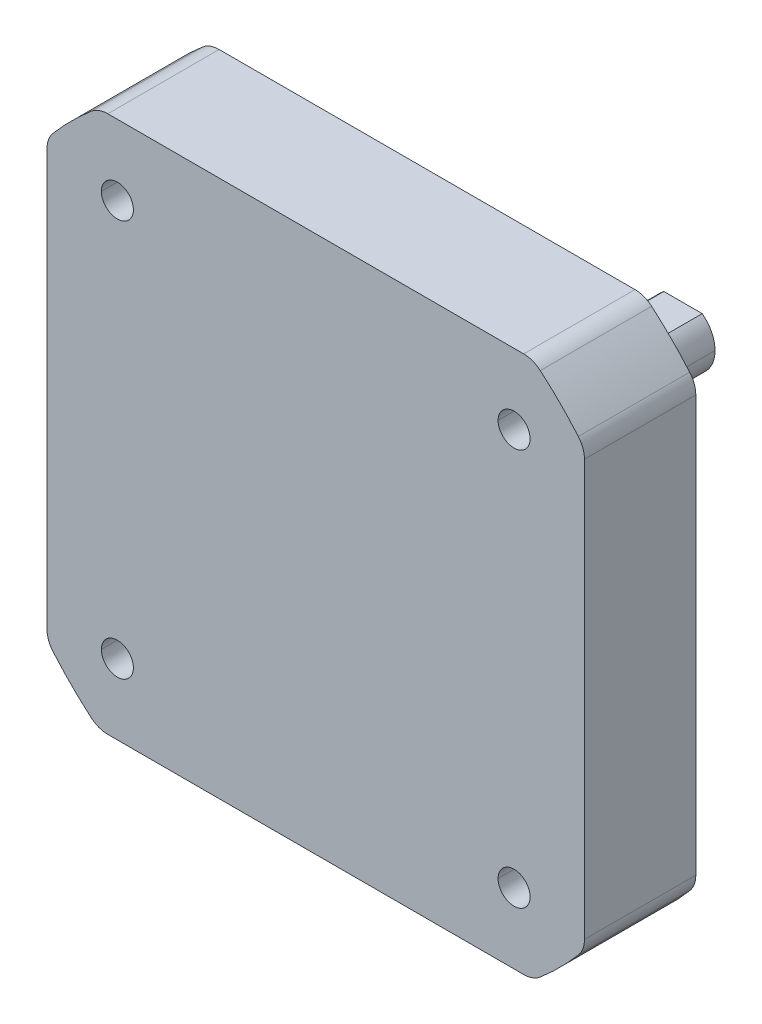
ISO-10303-21;
HEADER;
FILE_DESCRIPTION(('STEP AP214'),'2;1');
FILE_NAME('part.step','',(''),(''),'','','');
FILE_SCHEMA(('AUTOMOTIVE_DESIGN { 1 0 10303 214 1 1 1 1 }'));
ENDSEC;
DATA;
#1=APPLICATION_CONTEXT('core data for automotive mechanical design processes');
#2=APPLICATION_PROTOCOL_DEFINITION('international standard','automotive_design',2000,#1);
#3=PRODUCT_CONTEXT('',#1,'mechanical');
#4=PRODUCT('Part','Part','',(#3));
#5=PRODUCT_RELATED_PRODUCT_CATEGORY('part','',(#4));
#6=PRODUCT_DEFINITION_FORMATION('','',#4);
#7=PRODUCT_DEFINITION_CONTEXT('part definition',#1,'design');
#8=PRODUCT_DEFINITION('design','',#6,#7);
#9=PRODUCT_DEFINITION_SHAPE('','',#8);
#10=(LENGTH_UNIT() NAMED_UNIT(*) SI_UNIT(.MILLI.,.METRE.));
#11=(NAMED_UNIT(*) PLANE_ANGLE_UNIT() SI_UNIT($,.RADIAN.));
#12=(NAMED_UNIT(*) SI_UNIT($,.STERADIAN.) SOLID_ANGLE_UNIT());
#13=UNCERTAINTY_MEASURE_WITH_UNIT(LENGTH_MEASURE(1.E-05),#10,'distance_accuracy_value','');
#14=(GEOMETRIC_REPRESENTATION_CONTEXT(3) GLOBAL_UNCERTAINTY_ASSIGNED_CONTEXT((#13)) GLOBAL_UNIT_ASSIGNED_CONTEXT((#10,
#11,#12)) REPRESENTATION_CONTEXT('',''));
#15=CARTESIAN_POINT('',(0.,0.,0.));
#16=DIRECTION('',(0.,0.,1.));
#17=DIRECTION('',(1.,0.,0.));
#18=AXIS2_PLACEMENT_3D('',#15,#16,#17);
#19=CARTESIAN_POINT('',(0.,0.,-5.));
#20=DIRECTION('',(0.,0.,-1.));
#21=DIRECTION('',(0.,-1.,0.));
#22=AXIS2_PLACEMENT_3D('',#19,#20,#21);
#23=PLANE('',#22);
#24=CARTESIAN_POINT('',(0.,0.,-5.));
#25=DIRECTION('',(0.,0.,-1.));
#26=DIRECTION('',(-1.,0.,0.));
#27=AXIS2_PLACEMENT_3D('',#24,#25,#26);
#28=CIRCLE('',#27,2.5);
#29=CARTESIAN_POINT('',(-1.5,2.,-5.));
#30=VERTEX_POINT('',#29);
#31=CARTESIAN_POINT('',(1.5,2.,-5.));
#32=VERTEX_POINT('',#31);
#33=EDGE_CURVE('E318',#30,#32,#28,.T.);
#34=ORIENTED_EDGE('',*,*,#33,.T.);
#35=DIRECTION('',(-1.,0.,0.));
#36=VECTOR('',#35,1.);
#37=CARTESIAN_POINT('',(1.5,2.,-5.));
#38=LINE('',#37,#36);
#39=EDGE_CURVE('E11',#32,#30,#38,.T.);
#40=ORIENTED_EDGE('',*,*,#39,.T.);
#41=EDGE_LOOP('',(#34,#40));
#42=FACE_BOUND('',#41,.T.);
#43=ADVANCED_FACE('F17',(#42),#23,.T.);
#44=CARTESIAN_POINT('',(1.5,2.,-5.));
#45=DIRECTION('',(0.,-1.,0.));
#46=DIRECTION('',(0.,0.,-1.));
#47=AXIS2_PLACEMENT_3D('',#44,#45,#46);
#48=PLANE('',#47);
#49=DIRECTION('',(-1.,0.,0.));
#50=VECTOR('',#49,1.);
#51=CARTESIAN_POINT('',(1.5,2.,-20.));
#52=LINE('',#51,#50);
#53=CARTESIAN_POINT('',(1.5,2.,-20.));
#54=VERTEX_POINT('',#53);
#55=CARTESIAN_POINT('',(-1.5,2.,-20.));
#56=VERTEX_POINT('',#55);
#57=EDGE_CURVE('E26',#54,#56,#52,.T.);
#58=ORIENTED_EDGE('',*,*,#57,.T.);
#59=DIRECTION('',(0.,0.,-1.));
#60=VECTOR('',#59,1.);
#61=CARTESIAN_POINT('',(-1.5,2.,-5.));
#62=LINE('',#61,#60);
#63=EDGE_CURVE('E307',#30,#56,#62,.T.);
#64=ORIENTED_EDGE('',*,*,#63,.F.);
#65=ORIENTED_EDGE('',*,*,#39,.F.);
#66=DIRECTION('',(0.,0.,-1.));
#67=VECTOR('',#66,1.);
#68=CARTESIAN_POINT('',(1.5,2.,-5.));
#69=LINE('',#68,#67);
#70=EDGE_CURVE('E315',#32,#54,#69,.T.);
#71=ORIENTED_EDGE('',*,*,#70,.T.);
#72=EDGE_LOOP('',(#58,#64,#65,#71));
#73=FACE_BOUND('',#72,.T.);
#74=ADVANCED_FACE('F685',(#73),#48,.F.);
#75=CARTESIAN_POINT('',(0.,0.,-20.));
#76=DIRECTION('',(0.,0.,-1.));
#77=DIRECTION('',(0.,-1.,0.));
#78=AXIS2_PLACEMENT_3D('',#75,#76,#77);
#79=PLANE('',#78);
#80=ORIENTED_EDGE('',*,*,#57,.F.);
#81=CARTESIAN_POINT('',(0.,0.,-20.));
#82=DIRECTION('',(0.,0.,-1.));
#83=DIRECTION('',(-1.,0.,0.));
#84=AXIS2_PLACEMENT_3D('',#81,#82,#83);
#85=CIRCLE('',#84,2.5);
#86=CARTESIAN_POINT('',(2.5,0.,-20.));
#87=VERTEX_POINT('',#86);
#88=EDGE_CURVE('E286',#54,#87,#85,.T.);
#89=ORIENTED_EDGE('',*,*,#88,.T.);
#90=CARTESIAN_POINT('',(0.,0.,-20.));
#91=DIRECTION('',(0.,0.,-1.));
#92=DIRECTION('',(-1.,0.,0.));
#93=AXIS2_PLACEMENT_3D('',#90,#91,#92);
#94=CIRCLE('',#93,2.5);
#95=CARTESIAN_POINT('',(-2.5,0.,-20.));
#96=VERTEX_POINT('',#95);
#97=EDGE_CURVE('E280',#87,#96,#94,.T.);
#98=ORIENTED_EDGE('',*,*,#97,.T.);
#99=CARTESIAN_POINT('',(0.,0.,-20.));
#100=DIRECTION('',(0.,0.,-1.));
#101=DIRECTION('',(-1.,0.,0.));
#102=AXIS2_PLACEMENT_3D('',#99,#100,#101);
#103=CIRCLE('',#102,2.5);
#104=EDGE_CURVE('E284',#96,#56,#103,.T.);
#105=ORIENTED_EDGE('',*,*,#104,.T.);
#106=EDGE_LOOP('',(#80,#89,#98,#105));
#107=FACE_BOUND('',#106,.T.);
#108=ADVANCED_FACE('F282',(#107),#79,.T.);
#109=CARTESIAN_POINT('',(0.,0.,-20.));
#110=DIRECTION('',(0.,0.,1.));
#111=DIRECTION('',(1.,0.,0.));
#112=AXIS2_PLACEMENT_3D('',#109,#110,#111);
#113=CYLINDRICAL_SURFACE('',#112,2.5);
#114=DIRECTION('',(0.,0.,1.));
#115=VECTOR('',#114,1.);
#116=CARTESIAN_POINT('',(-2.5,0.,-20.));
#117=LINE('',#116,#115);
#118=CARTESIAN_POINT('',(-2.5,0.,-1.5));
#119=VERTEX_POINT('',#118);
#120=EDGE_CURVE('E294',#96,#119,#117,.T.);
#121=ORIENTED_EDGE('',*,*,#120,.F.);
#122=ORIENTED_EDGE('',*,*,#97,.F.);
#123=DIRECTION('',(0.,0.,1.));
#124=VECTOR('',#123,1.);
#125=CARTESIAN_POINT('',(2.5,0.,-20.));
#126=LINE('',#125,#124);
#127=CARTESIAN_POINT('',(2.5,0.,-1.5));
#128=VERTEX_POINT('',#127);
#129=EDGE_CURVE('E340',#87,#128,#126,.T.);
#130=ORIENTED_EDGE('',*,*,#129,.T.);
#131=CARTESIAN_POINT('',(0.,0.,-1.5));
#132=DIRECTION('',(0.,0.,1.));
#133=DIRECTION('',(-1.,0.,0.));
#134=AXIS2_PLACEMENT_3D('',#131,#132,#133);
#135=CIRCLE('',#134,2.5);
#136=EDGE_CURVE('E296',#119,#128,#135,.T.);
#137=ORIENTED_EDGE('',*,*,#136,.F.);
#138=EDGE_LOOP('',(#121,#122,#130,#137));
#139=FACE_BOUND('',#138,.T.);
#140=ADVANCED_FACE('F295',(#139),#113,.T.);
#141=CARTESIAN_POINT('',(0.,0.,-1.5));
#142=DIRECTION('',(0.,0.,1.));
#143=DIRECTION('',(1.,0.,0.));
#144=AXIS2_PLACEMENT_3D('',#141,#142,#143);
#145=CYLINDRICAL_SURFACE('',#144,11.);
#146=DIRECTION('',(0.,0.,1.));
#147=VECTOR('',#146,1.);
#148=CARTESIAN_POINT('',(-11.,0.,-1.5));
#149=LINE('',#148,#147);
#150=CARTESIAN_POINT('',(-11.,0.,-1.5));
#151=VERTEX_POINT('',#150);
#152=CARTESIAN_POINT('',(-11.,0.,0.));
#153=VERTEX_POINT('',#152);
#154=EDGE_CURVE('E365',#151,#153,#149,.T.);
#155=ORIENTED_EDGE('',*,*,#154,.F.);
#156=CARTESIAN_POINT('',(0.,0.,-1.5));
#157=DIRECTION('',(0.,0.,-1.));
#158=DIRECTION('',(-1.,0.,0.));
#159=AXIS2_PLACEMENT_3D('',#156,#157,#158);
#160=CIRCLE('',#159,11.);
#161=CARTESIAN_POINT('',(11.,0.,-1.5));
#162=VERTEX_POINT('',#161);
#163=EDGE_CURVE('E453',#162,#151,#160,.T.);
#164=ORIENTED_EDGE('',*,*,#163,.F.);
#165=DIRECTION('',(0.,0.,1.));
#166=VECTOR('',#165,1.);
#167=CARTESIAN_POINT('',(11.,0.,-1.5));
#168=LINE('',#167,#166);
#169=CARTESIAN_POINT('',(11.,0.,0.));
#170=VERTEX_POINT('',#169);
#171=EDGE_CURVE('E373',#162,#170,#168,.T.);
#172=ORIENTED_EDGE('',*,*,#171,.T.);
#173=CARTESIAN_POINT('',(0.,0.,0.));
#174=DIRECTION('',(0.,0.,-1.));
#175=DIRECTION('',(-1.,0.,0.));
#176=AXIS2_PLACEMENT_3D('',#173,#174,#175);
#177=CIRCLE('',#176,11.);
#178=EDGE_CURVE('E405',#170,#153,#177,.T.);
#179=ORIENTED_EDGE('',*,*,#178,.T.);
#180=EDGE_LOOP('',(#155,#164,#172,#179));
#181=FACE_BOUND('',#180,.T.);
#182=ADVANCED_FACE('F706',(#181),#145,.T.);
#183=CARTESIAN_POINT('',(15.5,15.5,0.));
#184=DIRECTION('',(0.,0.,-1.));
#185=DIRECTION('',(-1.,0.,0.));
#186=AXIS2_PLACEMENT_3D('',#183,#184,#185);
#187=CYLINDRICAL_SURFACE('',#186,1.24999999999999);
#188=DIRECTION('',(0.,0.,-1.));
#189=VECTOR('',#188,1.);
#190=CARTESIAN_POINT('',(16.75,15.5,0.));
#191=LINE('',#190,#189);
#192=CARTESIAN_POINT('',(16.75,15.5,8.7));
#193=VERTEX_POINT('',#192);
#194=CARTESIAN_POINT('',(16.75,15.5,0.));
#195=VERTEX_POINT('',#194);
#196=EDGE_CURVE('E324',#193,#195,#191,.T.);
#197=ORIENTED_EDGE('',*,*,#196,.F.);
#198=CARTESIAN_POINT('',(15.5,15.5,8.7));
#199=DIRECTION('',(0.,0.,-1.));
#200=DIRECTION('',(-1.,0.,0.));
#201=AXIS2_PLACEMENT_3D('',#198,#199,#200);
#202=CIRCLE('',#201,1.24999999999999);
#203=CARTESIAN_POINT('',(14.25,15.5,8.7));
#204=VERTEX_POINT('',#203);
#205=EDGE_CURVE('E439',#204,#193,#202,.T.);
#206=ORIENTED_EDGE('',*,*,#205,.F.);
#207=DIRECTION('',(0.,0.,-1.));
#208=VECTOR('',#207,1.);
#209=CARTESIAN_POINT('',(14.25,15.5,0.));
#210=LINE('',#209,#208);
#211=CARTESIAN_POINT('',(14.25,15.5,0.));
#212=VERTEX_POINT('',#211);
#213=EDGE_CURVE('E344',#204,#212,#210,.T.);
#214=ORIENTED_EDGE('',*,*,#213,.T.);
#215=CARTESIAN_POINT('',(15.5,15.5,0.));
#216=DIRECTION('',(0.,0.,-1.));
#217=DIRECTION('',(-1.,0.,0.));
#218=AXIS2_PLACEMENT_3D('',#215,#216,#217);
#219=CIRCLE('',#218,1.24999999999999);
#220=EDGE_CURVE('E409',#212,#195,#219,.T.);
#221=ORIENTED_EDGE('',*,*,#220,.T.);
#222=EDGE_LOOP('',(#197,#206,#214,#221));
#223=FACE_BOUND('',#222,.T.);
#224=ADVANCED_FACE('F739',(#223),#187,.F.);
#225=CARTESIAN_POINT('',(-15.5,15.5,0.));
#226=DIRECTION('',(0.,0.,-1.));
#227=DIRECTION('',(-1.,0.,0.));
#228=AXIS2_PLACEMENT_3D('',#225,#226,#227);
#229=CYLINDRICAL_SURFACE('',#228,1.24999999999999);
#230=DIRECTION('',(0.,0.,-1.));
#231=VECTOR('',#230,1.);
#232=CARTESIAN_POINT('',(-14.25,15.5,0.));
#233=LINE('',#232,#231);
#234=CARTESIAN_POINT('',(-14.25,15.5,8.7));
#235=VERTEX_POINT('',#234);
#236=CARTESIAN_POINT('',(-14.25,15.5,0.));
#237=VERTEX_POINT('',#236);
#238=EDGE_CURVE('E388',#235,#237,#233,.T.);
#239=ORIENTED_EDGE('',*,*,#238,.F.);
#240=CARTESIAN_POINT('',(-15.5,15.5,8.7));
#241=DIRECTION('',(0.,0.,-1.));
#242=DIRECTION('',(-1.,0.,0.));
#243=AXIS2_PLACEMENT_3D('',#240,#241,#242);
#244=CIRCLE('',#243,1.24999999999999);
#245=CARTESIAN_POINT('',(-16.75,15.5,8.7));
#246=VERTEX_POINT('',#245);
#247=EDGE_CURVE('E436',#246,#235,#244,.T.);
#248=ORIENTED_EDGE('',*,*,#247,.F.);
#249=DIRECTION('',(0.,0.,-1.));
#250=VECTOR('',#249,1.);
#251=CARTESIAN_POINT('',(-16.75,15.5,0.));
#252=LINE('',#251,#250);
#253=CARTESIAN_POINT('',(-16.75,15.5,0.));
#254=VERTEX_POINT('',#253);
#255=EDGE_CURVE('E396',#246,#254,#252,.T.);
#256=ORIENTED_EDGE('',*,*,#255,.T.);
#257=CARTESIAN_POINT('',(-15.5,15.5,0.));
#258=DIRECTION('',(0.,0.,-1.));
#259=DIRECTION('',(-1.,0.,0.));
#260=AXIS2_PLACEMENT_3D('',#257,#258,#259);
#261=CIRCLE('',#260,1.24999999999999);
#262=EDGE_CURVE('E535',#254,#237,#261,.T.);
#263=ORIENTED_EDGE('',*,*,#262,.T.);
#264=EDGE_LOOP('',(#239,#248,#256,#263));
#265=FACE_BOUND('',#264,.T.);
#266=ADVANCED_FACE('F1006',(#265),#229,.F.);
#267=CARTESIAN_POINT('',(-15.5,-15.5,0.));
#268=DIRECTION('',(0.,0.,-1.));
#269=DIRECTION('',(-1.,0.,0.));
#270=AXIS2_PLACEMENT_3D('',#267,#268,#269);
#271=CYLINDRICAL_SURFACE('',#270,1.24999999999999);
#272=DIRECTION('',(0.,0.,-1.));
#273=VECTOR('',#272,1.);
#274=CARTESIAN_POINT('',(-14.25,-15.5,0.));
#275=LINE('',#274,#273);
#276=CARTESIAN_POINT('',(-14.25,-15.5,8.7));
#277=VERTEX_POINT('',#276);
#278=CARTESIAN_POINT('',(-14.25,-15.5,0.));
#279=VERTEX_POINT('',#278);
#280=EDGE_CURVE('E404',#277,#279,#275,.T.);
#281=ORIENTED_EDGE('',*,*,#280,.F.);
#282=CARTESIAN_POINT('',(-15.5,-15.5,8.7));
#283=DIRECTION('',(0.,0.,-1.));
#284=DIRECTION('',(-1.,0.,0.));
#285=AXIS2_PLACEMENT_3D('',#282,#283,#284);
#286=CIRCLE('',#285,1.24999999999999);
#287=CARTESIAN_POINT('',(-16.75,-15.5,8.7));
#288=VERTEX_POINT('',#287);
#289=EDGE_CURVE('E20',#288,#277,#286,.T.);
#290=ORIENTED_EDGE('',*,*,#289,.F.);
#291=DIRECTION('',(0.,0.,-1.));
#292=VECTOR('',#291,1.);
#293=CARTESIAN_POINT('',(-16.75,-15.5,0.));
#294=LINE('',#293,#292);
#295=CARTESIAN_POINT('',(-16.75,-15.5,0.));
#296=VERTEX_POINT('',#295);
#297=EDGE_CURVE('E417',#288,#296,#294,.T.);
#298=ORIENTED_EDGE('',*,*,#297,.T.);
#299=CARTESIAN_POINT('',(-15.5,-15.5,0.));
#300=DIRECTION('',(0.,0.,-1.));
#301=DIRECTION('',(-1.,0.,0.));
#302=AXIS2_PLACEMENT_3D('',#299,#300,#301);
#303=CIRCLE('',#302,1.24999999999999);
#304=EDGE_CURVE('E532',#296,#279,#303,.T.);
#305=ORIENTED_EDGE('',*,*,#304,.T.);
#306=EDGE_LOOP('',(#281,#290,#298,#305));
#307=FACE_BOUND('',#306,.T.);
#308=ADVANCED_FACE('F1013',(#307),#271,.F.);
#309=CARTESIAN_POINT('',(15.5,-15.5,0.));
#310=DIRECTION('',(0.,0.,-1.));
#311=DIRECTION('',(-1.,0.,0.));
#312=AXIS2_PLACEMENT_3D('',#309,#310,#311);
#313=CYLINDRICAL_SURFACE('',#312,1.24999999999999);
#314=DIRECTION('',(0.,0.,-1.));
#315=VECTOR('',#314,1.);
#316=CARTESIAN_POINT('',(16.75,-15.5,0.));
#317=LINE('',#316,#315);
#318=CARTESIAN_POINT('',(16.75,-15.5,8.7));
#319=VERTEX_POINT('',#318);
#320=CARTESIAN_POINT('',(16.75,-15.5,0.));
#321=VERTEX_POINT('',#320);
#322=EDGE_CURVE('E435',#319,#321,#317,.T.);
#323=ORIENTED_EDGE('',*,*,#322,.F.);
#324=CARTESIAN_POINT('',(15.5,-15.5,8.7));
#325=DIRECTION('',(0.,0.,-1.));
#326=DIRECTION('',(-1.,0.,0.));
#327=AXIS2_PLACEMENT_3D('',#324,#325,#326);
#328=CIRCLE('',#327,1.24999999999999);
#329=CARTESIAN_POINT('',(14.25,-15.5,8.7));
#330=VERTEX_POINT('',#329);
#331=EDGE_CURVE('E291',#330,#319,#328,.T.);
#332=ORIENTED_EDGE('',*,*,#331,.F.);
#333=DIRECTION('',(0.,0.,-1.));
#334=VECTOR('',#333,1.);
#335=CARTESIAN_POINT('',(14.25,-15.5,0.));
#336=LINE('',#335,#334);
#337=CARTESIAN_POINT('',(14.25,-15.5,0.));
#338=VERTEX_POINT('',#337);
#339=EDGE_CURVE('E447',#330,#338,#336,.T.);
#340=ORIENTED_EDGE('',*,*,#339,.T.);
#341=CARTESIAN_POINT('',(15.5,-15.5,0.));
#342=DIRECTION('',(0.,0.,-1.));
#343=DIRECTION('',(-1.,0.,0.));
#344=AXIS2_PLACEMENT_3D('',#341,#342,#343);
#345=CIRCLE('',#344,1.24999999999999);
#346=EDGE_CURVE('E526',#338,#321,#345,.T.);
#347=ORIENTED_EDGE('',*,*,#346,.T.);
#348=EDGE_LOOP('',(#323,#332,#340,#347));
#349=FACE_BOUND('',#348,.T.);
#350=ADVANCED_FACE('F724',(#349),#313,.F.);
#351=CARTESIAN_POINT('',(19.,-16.248076809272,8.7));
#352=DIRECTION('',(0.,0.,-1.));
#353=DIRECTION('',(0.,-1.,0.));
#354=AXIS2_PLACEMENT_3D('',#351,#352,#353);
#355=PLANE('',#354);
#356=ORIENTED_EDGE('',*,*,#331,.T.);
#357=CARTESIAN_POINT('',(15.5,-15.5,8.7));
#358=DIRECTION('',(0.,0.,-1.));
#359=DIRECTION('',(-1.,0.,0.));
#360=AXIS2_PLACEMENT_3D('',#357,#358,#359);
#361=CIRCLE('',#360,1.24999999999999);
#362=EDGE_CURVE('E426',#319,#330,#361,.T.);
#363=ORIENTED_EDGE('',*,*,#362,.T.);
#364=EDGE_LOOP('',(#356,#363));
#365=FACE_BOUND('',#364,.T.);
#366=ORIENTED_EDGE('',*,*,#289,.T.);
#367=CARTESIAN_POINT('',(-15.5,-15.5,8.7));
#368=DIRECTION('',(0.,0.,-1.));
#369=DIRECTION('',(-1.,0.,0.));
#370=AXIS2_PLACEMENT_3D('',#367,#368,#369);
#371=CIRCLE('',#370,1.24999999999999);
#372=EDGE_CURVE('E400',#277,#288,#371,.T.);
#373=ORIENTED_EDGE('',*,*,#372,.T.);
#374=EDGE_LOOP('',(#366,#373));
#375=FACE_BOUND('',#374,.T.);
#376=ORIENTED_EDGE('',*,*,#247,.T.);
#377=CARTESIAN_POINT('',(-15.5,15.5,8.7));
#378=DIRECTION('',(0.,0.,-1.));
#379=DIRECTION('',(-1.,0.,0.));
#380=AXIS2_PLACEMENT_3D('',#377,#378,#379);
#381=CIRCLE('',#380,1.24999999999999);
#382=EDGE_CURVE('E353',#235,#246,#381,.T.);
#383=ORIENTED_EDGE('',*,*,#382,.T.);
#384=EDGE_LOOP('',(#376,#383));
#385=FACE_BOUND('',#384,.T.);
#386=ORIENTED_EDGE('',*,*,#205,.T.);
#387=CARTESIAN_POINT('',(15.5,15.5,8.7));
#388=DIRECTION('',(0.,0.,-1.));
#389=DIRECTION('',(-1.,0.,0.));
#390=AXIS2_PLACEMENT_3D('',#387,#388,#389);
#391=CIRCLE('',#390,1.24999999999999);
#392=EDGE_CURVE('E329',#193,#204,#391,.T.);
#393=ORIENTED_EDGE('',*,*,#392,.T.);
#394=EDGE_LOOP('',(#386,#393));
#395=FACE_BOUND('',#394,.T.);
#396=CARTESIAN_POINT('',(19.,-16.248076809272,8.7));
#397=DIRECTION('',(0.,0.,1.));
#398=DIRECTION('',(-1.,0.,0.));
#399=AXIS2_PLACEMENT_3D('',#396,#397,#398);
#400=CIRCLE('',#399,2.);
#401=CARTESIAN_POINT('',(20.52,-17.5479229540137,8.7));
#402=VERTEX_POINT('',#401);
#403=CARTESIAN_POINT('',(21.,-16.248076809272,8.7));
#404=VERTEX_POINT('',#403);
#405=EDGE_CURVE('E542',#402,#404,#400,.T.);
#406=ORIENTED_EDGE('',*,*,#405,.T.);
#407=DIRECTION('',(0.,1.,0.));
#408=VECTOR('',#407,1.);
#409=CARTESIAN_POINT('',(21.,16.248076809272,8.7));
#410=LINE('',#409,#408);
#411=CARTESIAN_POINT('',(21.,16.248076809272,8.7));
#412=VERTEX_POINT('',#411);
#413=EDGE_CURVE('E431',#404,#412,#410,.T.);
#414=ORIENTED_EDGE('',*,*,#413,.T.);
#415=CARTESIAN_POINT('',(19.,16.248076809272,8.7));
#416=DIRECTION('',(0.,0.,1.));
#417=DIRECTION('',(1.,0.,0.));
#418=AXIS2_PLACEMENT_3D('',#415,#416,#417);
#419=CIRCLE('',#418,2.);
#420=CARTESIAN_POINT('',(20.52,17.5479229540137,8.7));
#421=VERTEX_POINT('',#420);
#422=EDGE_CURVE('E430',#412,#421,#419,.T.);
#423=ORIENTED_EDGE('',*,*,#422,.T.);
#424=CARTESIAN_POINT('',(0.,0.,8.7));
#425=DIRECTION('',(0.,0.,1.));
#426=DIRECTION('',(1.,0.,0.));
#427=AXIS2_PLACEMENT_3D('',#424,#425,#426);
#428=CIRCLE('',#427,27.);
#429=CARTESIAN_POINT('',(17.5479229540137,20.52,8.7));
#430=VERTEX_POINT('',#429);
#431=EDGE_CURVE('E563',#421,#430,#428,.T.);
#432=ORIENTED_EDGE('',*,*,#431,.T.);
#433=CARTESIAN_POINT('',(16.2480768092719,19.,8.7));
#434=DIRECTION('',(0.,0.,1.));
#435=DIRECTION('',(1.,0.,0.));
#436=AXIS2_PLACEMENT_3D('',#433,#434,#435);
#437=CIRCLE('',#436,2.);
#438=CARTESIAN_POINT('',(16.2480768092719,21.,8.7));
#439=VERTEX_POINT('',#438);
#440=EDGE_CURVE('E569',#430,#439,#437,.T.);
#441=ORIENTED_EDGE('',*,*,#440,.T.);
#442=DIRECTION('',(-1.,0.,0.));
#443=VECTOR('',#442,1.);
#444=CARTESIAN_POINT('',(-16.2480768092719,21.,8.7));
#445=LINE('',#444,#443);
#446=CARTESIAN_POINT('',(-16.2480768092719,21.,8.7));
#447=VERTEX_POINT('',#446);
#448=EDGE_CURVE('E467',#439,#447,#445,.T.);
#449=ORIENTED_EDGE('',*,*,#448,.T.);
#450=CARTESIAN_POINT('',(-16.2480768092719,19.,8.7));
#451=DIRECTION('',(0.,0.,1.));
#452=DIRECTION('',(-1.,0.,0.));
#453=AXIS2_PLACEMENT_3D('',#450,#451,#452);
#454=CIRCLE('',#453,2.);
#455=CARTESIAN_POINT('',(-17.5479229540137,20.52,8.7));
#456=VERTEX_POINT('',#455);
#457=EDGE_CURVE('E422',#447,#456,#454,.T.);
#458=ORIENTED_EDGE('',*,*,#457,.T.);
#459=CARTESIAN_POINT('',(0.,0.,8.7));
#460=DIRECTION('',(0.,0.,1.));
#461=DIRECTION('',(1.,0.,0.));
#462=AXIS2_PLACEMENT_3D('',#459,#460,#461);
#463=CIRCLE('',#462,27.);
#464=CARTESIAN_POINT('',(-20.52,17.5479229540137,8.7));
#465=VERTEX_POINT('',#464);
#466=EDGE_CURVE('E421',#456,#465,#463,.T.);
#467=ORIENTED_EDGE('',*,*,#466,.T.);
#468=CARTESIAN_POINT('',(-19.,16.248076809272,8.7));
#469=DIRECTION('',(0.,0.,1.));
#470=DIRECTION('',(-1.,0.,0.));
#471=AXIS2_PLACEMENT_3D('',#468,#469,#470);
#472=CIRCLE('',#471,2.);
#473=CARTESIAN_POINT('',(-21.,16.248076809272,8.7));
#474=VERTEX_POINT('',#473);
#475=EDGE_CURVE('E378',#465,#474,#472,.T.);
#476=ORIENTED_EDGE('',*,*,#475,.T.);
#477=DIRECTION('',(0.,-1.,0.));
#478=VECTOR('',#477,1.);
#479=CARTESIAN_POINT('',(-21.,16.248076809272,8.7));
#480=LINE('',#479,#478);
#481=CARTESIAN_POINT('',(-21.,-16.248076809272,8.7));
#482=VERTEX_POINT('',#481);
#483=EDGE_CURVE('E377',#474,#482,#480,.T.);
#484=ORIENTED_EDGE('',*,*,#483,.T.);
#485=CARTESIAN_POINT('',(-19.,-16.248076809272,8.7));
#486=DIRECTION('',(0.,0.,1.));
#487=DIRECTION('',(1.,0.,0.));
#488=AXIS2_PLACEMENT_3D('',#485,#486,#487);
#489=CIRCLE('',#488,2.);
#490=CARTESIAN_POINT('',(-20.52,-17.5479229540137,8.7));
#491=VERTEX_POINT('',#490);
#492=EDGE_CURVE('E337',#482,#491,#489,.T.);
#493=ORIENTED_EDGE('',*,*,#492,.T.);
#494=CARTESIAN_POINT('',(0.,0.,8.7));
#495=DIRECTION('',(0.,0.,1.));
#496=DIRECTION('',(1.,0.,0.));
#497=AXIS2_PLACEMENT_3D('',#494,#495,#496);
#498=CIRCLE('',#497,27.);
#499=CARTESIAN_POINT('',(-17.5479229540137,-20.52,8.7));
#500=VERTEX_POINT('',#499);
#501=EDGE_CURVE('E336',#491,#500,#498,.T.);
#502=ORIENTED_EDGE('',*,*,#501,.T.);
#503=CARTESIAN_POINT('',(-16.2480768092719,-19.,8.7));
#504=DIRECTION('',(0.,0.,1.));
#505=DIRECTION('',(1.,0.,0.));
#506=AXIS2_PLACEMENT_3D('',#503,#504,#505);
#507=CIRCLE('',#506,2.);
#508=CARTESIAN_POINT('',(-16.2480768092719,-21.,8.7));
#509=VERTEX_POINT('',#508);
#510=EDGE_CURVE('E457',#500,#509,#507,.T.);
#511=ORIENTED_EDGE('',*,*,#510,.T.);
#512=DIRECTION('',(1.,0.,0.));
#513=VECTOR('',#512,1.);
#514=CARTESIAN_POINT('',(-16.2480768092719,-21.,8.7));
#515=LINE('',#514,#513);
#516=CARTESIAN_POINT('',(16.2480768092719,-21.,8.7));
#517=VERTEX_POINT('',#516);
#518=EDGE_CURVE('E600',#509,#517,#515,.T.);
#519=ORIENTED_EDGE('',*,*,#518,.T.);
#520=CARTESIAN_POINT('',(16.2480768092719,-19.,8.7));
#521=DIRECTION('',(0.,0.,1.));
#522=DIRECTION('',(-1.,0.,0.));
#523=AXIS2_PLACEMENT_3D('',#520,#521,#522);
#524=CIRCLE('',#523,2.);
#525=CARTESIAN_POINT('',(17.5479229540137,-20.52,8.7));
#526=VERTEX_POINT('',#525);
#527=EDGE_CURVE('E47',#517,#526,#524,.T.);
#528=ORIENTED_EDGE('',*,*,#527,.T.);
#529=CARTESIAN_POINT('',(0.,0.,8.7));
#530=DIRECTION('',(0.,0.,1.));
#531=DIRECTION('',(1.,0.,0.));
#532=AXIS2_PLACEMENT_3D('',#529,#530,#531);
#533=CIRCLE('',#532,27.);
#534=EDGE_CURVE('E38',#526,#402,#533,.T.);
#535=ORIENTED_EDGE('',*,*,#534,.T.);
#536=EDGE_LOOP('',(#406,#414,#423,#432,#441,#449,#458,#467,#476,#484,#493,#502,#511,#519,#528,#535));
#537=FACE_BOUND('',#536,.T.);
#538=ADVANCED_FACE('F611',(#365,#375,#385,#395,#537),#355,.F.);
#539=CARTESIAN_POINT('',(0.,0.,8.7));
#540=DIRECTION('',(0.,0.,-1.));
#541=DIRECTION('',(-1.,0.,0.));
#542=AXIS2_PLACEMENT_3D('',#539,#540,#541);
#543=CYLINDRICAL_SURFACE('',#542,27.);
#544=CARTESIAN_POINT('',(0.,0.,0.));
#545=DIRECTION('',(0.,0.,1.));
#546=DIRECTION('',(1.,0.,0.));
#547=AXIS2_PLACEMENT_3D('',#544,#545,#546);
#548=CIRCLE('',#547,27.);
#549=CARTESIAN_POINT('',(17.5479229540137,-20.52,0.));
#550=VERTEX_POINT('',#549);
#551=CARTESIAN_POINT('',(20.52,-17.5479229540137,0.));
#552=VERTEX_POINT('',#551);
#553=EDGE_CURVE('E322',#550,#552,#548,.T.);
#554=ORIENTED_EDGE('',*,*,#553,.T.);
#555=DIRECTION('',(0.,0.,-1.));
#556=VECTOR('',#555,1.);
#557=CARTESIAN_POINT('',(20.52,-17.5479229540137,8.7));
#558=LINE('',#557,#556);
#559=EDGE_CURVE('E546',#402,#552,#558,.T.);
#560=ORIENTED_EDGE('',*,*,#559,.F.);
#561=ORIENTED_EDGE('',*,*,#534,.F.);
#562=DIRECTION('',(0.,0.,-1.));
#563=VECTOR('',#562,1.);
#564=CARTESIAN_POINT('',(17.5479229540137,-20.52,8.7));
#565=LINE('',#564,#563);
#566=EDGE_CURVE('E603',#526,#550,#565,.T.);
#567=ORIENTED_EDGE('',*,*,#566,.T.);
#568=EDGE_LOOP('',(#554,#560,#561,#567));
#569=FACE_BOUND('',#568,.T.);
#570=ADVANCED_FACE('F614',(#569),#543,.T.);
#571=CARTESIAN_POINT('',(16.2480768092719,-19.,8.7));
#572=DIRECTION('',(0.,0.,-1.));
#573=DIRECTION('',(-1.,0.,0.));
#574=AXIS2_PLACEMENT_3D('',#571,#572,#573);
#575=CYLINDRICAL_SURFACE('',#574,2.);
#576=CARTESIAN_POINT('',(16.2480768092719,-19.,0.));
#577=DIRECTION('',(0.,0.,1.));
#578=DIRECTION('',(-1.,0.,0.));
#579=AXIS2_PLACEMENT_3D('',#576,#577,#578);
#580=CIRCLE('',#579,2.);
#581=CARTESIAN_POINT('',(16.2480768092719,-21.,0.));
#582=VERTEX_POINT('',#581);
#583=EDGE_CURVE('E463',#582,#550,#580,.T.);
#584=ORIENTED_EDGE('',*,*,#583,.T.);
#585=ORIENTED_EDGE('',*,*,#566,.F.);
#586=ORIENTED_EDGE('',*,*,#527,.F.);
#587=DIRECTION('',(0.,0.,-1.));
#588=VECTOR('',#587,1.);
#589=CARTESIAN_POINT('',(16.2480768092719,-21.,8.7));
#590=LINE('',#589,#588);
#591=EDGE_CURVE('E597',#517,#582,#590,.T.);
#592=ORIENTED_EDGE('',*,*,#591,.T.);
#593=EDGE_LOOP('',(#584,#585,#586,#592));
#594=FACE_BOUND('',#593,.T.);
#595=ADVANCED_FACE('F674',(#594),#575,.T.);
#596=CARTESIAN_POINT('',(-16.2480768092719,-21.,8.7));
#597=DIRECTION('',(0.,1.,0.));
#598=DIRECTION('',(1.,0.,0.));
#599=AXIS2_PLACEMENT_3D('',#596,#597,#598);
#600=PLANE('',#599);
#601=DIRECTION('',(1.,0.,0.));
#602=VECTOR('',#601,1.);
#603=CARTESIAN_POINT('',(-16.2480768092719,-21.,0.));
#604=LINE('',#603,#602);
#605=CARTESIAN_POINT('',(-16.2480768092719,-21.,0.));
#606=VERTEX_POINT('',#605);
#607=EDGE_CURVE('E471',#606,#582,#604,.T.);
#608=ORIENTED_EDGE('',*,*,#607,.T.);
#609=ORIENTED_EDGE('',*,*,#591,.F.);
#610=ORIENTED_EDGE('',*,*,#518,.F.);
#611=DIRECTION('',(0.,0.,-1.));
#612=VECTOR('',#611,1.);
#613=CARTESIAN_POINT('',(-16.2480768092719,-21.,8.7));
#614=LINE('',#613,#612);
#615=EDGE_CURVE('E454',#509,#606,#614,.T.);
#616=ORIENTED_EDGE('',*,*,#615,.T.);
#617=EDGE_LOOP('',(#608,#609,#610,#616));
#618=FACE_BOUND('',#617,.T.);
#619=ADVANCED_FACE('F672',(#618),#600,.F.);
#620=CARTESIAN_POINT('',(-16.2480768092719,-19.,8.7));
#621=DIRECTION('',(0.,0.,-1.));
#622=DIRECTION('',(-1.,0.,0.));
#623=AXIS2_PLACEMENT_3D('',#620,#621,#622);
#624=CYLINDRICAL_SURFACE('',#623,2.);
#625=CARTESIAN_POINT('',(-16.2480768092719,-19.,0.));
#626=DIRECTION('',(0.,0.,1.));
#627=DIRECTION('',(1.,0.,0.));
#628=AXIS2_PLACEMENT_3D('',#625,#626,#627);
#629=CIRCLE('',#628,2.);
#630=CARTESIAN_POINT('',(-17.5479229540137,-20.52,0.));
#631=VERTEX_POINT('',#630);
#632=EDGE_CURVE('E478',#631,#606,#629,.T.);
#633=ORIENTED_EDGE('',*,*,#632,.T.);
#634=ORIENTED_EDGE('',*,*,#615,.F.);
#635=ORIENTED_EDGE('',*,*,#510,.F.);
#636=DIRECTION('',(0.,0.,-1.));
#637=VECTOR('',#636,1.);
#638=CARTESIAN_POINT('',(-17.5479229540137,-20.52,8.7));
#639=LINE('',#638,#637);
#640=EDGE_CURVE('E333',#500,#631,#639,.T.);
#641=ORIENTED_EDGE('',*,*,#640,.T.);
#642=EDGE_LOOP('',(#633,#634,#635,#641));
#643=FACE_BOUND('',#642,.T.);
#644=ADVANCED_FACE('F669',(#643),#624,.T.);
#645=CARTESIAN_POINT('',(0.,0.,8.7));
#646=DIRECTION('',(0.,0.,-1.));
#647=DIRECTION('',(-1.,0.,0.));
#648=AXIS2_PLACEMENT_3D('',#645,#646,#647);
#649=CYLINDRICAL_SURFACE('',#648,27.);
#650=CARTESIAN_POINT('',(0.,0.,0.));
#651=DIRECTION('',(0.,0.,1.));
#652=DIRECTION('',(1.,0.,0.));
#653=AXIS2_PLACEMENT_3D('',#650,#651,#652);
#654=CIRCLE('',#653,27.);
#655=CARTESIAN_POINT('',(-20.52,-17.5479229540137,0.));
#656=VERTEX_POINT('',#655);
#657=EDGE_CURVE('E482',#656,#631,#654,.T.);
#658=ORIENTED_EDGE('',*,*,#657,.T.);
#659=ORIENTED_EDGE('',*,*,#640,.F.);
#660=ORIENTED_EDGE('',*,*,#501,.F.);
#661=DIRECTION('',(0.,0.,-1.));
#662=VECTOR('',#661,1.);
#663=CARTESIAN_POINT('',(-20.52,-17.5479229540137,8.7));
#664=LINE('',#663,#662);
#665=EDGE_CURVE('E501',#491,#656,#664,.T.);
#666=ORIENTED_EDGE('',*,*,#665,.T.);
#667=EDGE_LOOP('',(#658,#659,#660,#666));
#668=FACE_BOUND('',#667,.T.);
#669=ADVANCED_FACE('F663',(#668),#649,.T.);
#670=CARTESIAN_POINT('',(-19.,-16.248076809272,8.7));
#671=DIRECTION('',(0.,0.,-1.));
#672=DIRECTION('',(-1.,0.,0.));
#673=AXIS2_PLACEMENT_3D('',#670,#671,#672);
#674=CYLINDRICAL_SURFACE('',#673,2.);
#675=CARTESIAN_POINT('',(-19.,-16.248076809272,0.));
#676=DIRECTION('',(0.,0.,1.));
#677=DIRECTION('',(1.,0.,0.));
#678=AXIS2_PLACEMENT_3D('',#675,#676,#677);
#679=CIRCLE('',#678,2.);
#680=CARTESIAN_POINT('',(-21.,-16.248076809272,0.));
#681=VERTEX_POINT('',#680);
#682=EDGE_CURVE('E361',#681,#656,#679,.T.);
#683=ORIENTED_EDGE('',*,*,#682,.T.);
#684=ORIENTED_EDGE('',*,*,#665,.F.);
#685=ORIENTED_EDGE('',*,*,#492,.F.);
#686=DIRECTION('',(0.,0.,-1.));
#687=VECTOR('',#686,1.);
#688=CARTESIAN_POINT('',(-21.,-16.248076809272,8.7));
#689=LINE('',#688,#687);
#690=EDGE_CURVE('E374',#482,#681,#689,.T.);
#691=ORIENTED_EDGE('',*,*,#690,.T.);
#692=EDGE_LOOP('',(#683,#684,#685,#691));
#693=FACE_BOUND('',#692,.T.);
#694=ADVANCED_FACE('F660',(#693),#674,.T.);
#695=CARTESIAN_POINT('',(-21.,16.248076809272,8.7));
#696=DIRECTION('',(1.,0.,0.));
#697=DIRECTION('',(0.,1.,0.));
#698=AXIS2_PLACEMENT_3D('',#695,#696,#697);
#699=PLANE('',#698);
#700=DIRECTION('',(0.,-1.,0.));
#701=VECTOR('',#700,1.);
#702=CARTESIAN_POINT('',(-21.,16.248076809272,0.));
#703=LINE('',#702,#701);
#704=CARTESIAN_POINT('',(-21.,16.248076809272,0.));
#705=VERTEX_POINT('',#704);
#706=EDGE_CURVE('E356',#705,#681,#703,.T.);
#707=ORIENTED_EDGE('',*,*,#706,.T.);
#708=ORIENTED_EDGE('',*,*,#690,.F.);
#709=ORIENTED_EDGE('',*,*,#483,.F.);
#710=DIRECTION('',(0.,0.,-1.));
#711=VECTOR('',#710,1.);
#712=CARTESIAN_POINT('',(-21.,16.248076809272,8.7));
#713=LINE('',#712,#711);
#714=EDGE_CURVE('E585',#474,#705,#713,.T.);
#715=ORIENTED_EDGE('',*,*,#714,.T.);
#716=EDGE_LOOP('',(#707,#708,#709,#715));
#717=FACE_BOUND('',#716,.T.);
#718=ADVANCED_FACE('F657',(#717),#699,.F.);
#719=CARTESIAN_POINT('',(-19.,16.248076809272,8.7));
#720=DIRECTION('',(0.,0.,-1.));
#721=DIRECTION('',(-1.,0.,0.));
#722=AXIS2_PLACEMENT_3D('',#719,#720,#721);
#723=CYLINDRICAL_SURFACE('',#722,2.);
#724=CARTESIAN_POINT('',(-19.,16.248076809272,0.));
#725=DIRECTION('',(0.,0.,1.));
#726=DIRECTION('',(-1.,0.,0.));
#727=AXIS2_PLACEMENT_3D('',#724,#725,#726);
#728=CIRCLE('',#727,2.);
#729=CARTESIAN_POINT('',(-20.52,17.5479229540137,0.));
#730=VERTEX_POINT('',#729);
#731=EDGE_CURVE('E360',#730,#705,#728,.T.);
#732=ORIENTED_EDGE('',*,*,#731,.T.);
#733=ORIENTED_EDGE('',*,*,#714,.F.);
#734=ORIENTED_EDGE('',*,*,#475,.F.);
#735=DIRECTION('',(0.,0.,-1.));
#736=VECTOR('',#735,1.);
#737=CARTESIAN_POINT('',(-20.52,17.5479229540137,8.7));
#738=LINE('',#737,#736);
#739=EDGE_CURVE('E418',#465,#730,#738,.T.);
#740=ORIENTED_EDGE('',*,*,#739,.T.);
#741=EDGE_LOOP('',(#732,#733,#734,#740));
#742=FACE_BOUND('',#741,.T.);
#743=ADVANCED_FACE('F651',(#742),#723,.T.);
#744=CARTESIAN_POINT('',(0.,0.,8.7));
#745=DIRECTION('',(0.,0.,-1.));
#746=DIRECTION('',(-1.,0.,0.));
#747=AXIS2_PLACEMENT_3D('',#744,#745,#746);
#748=CYLINDRICAL_SURFACE('',#747,27.);
#749=CARTESIAN_POINT('',(0.,0.,0.));
#750=DIRECTION('',(0.,0.,1.));
#751=DIRECTION('',(1.,0.,0.));
#752=AXIS2_PLACEMENT_3D('',#749,#750,#751);
#753=CIRCLE('',#752,27.);
#754=CARTESIAN_POINT('',(-17.5479229540137,20.52,0.));
#755=VERTEX_POINT('',#754);
#756=EDGE_CURVE('E492',#755,#730,#753,.T.);
#757=ORIENTED_EDGE('',*,*,#756,.T.);
#758=ORIENTED_EDGE('',*,*,#739,.F.);
#759=ORIENTED_EDGE('',*,*,#466,.F.);
#760=DIRECTION('',(0.,0.,-1.));
#761=VECTOR('',#760,1.);
#762=CARTESIAN_POINT('',(-17.5479229540137,20.52,8.7));
#763=LINE('',#762,#761);
#764=EDGE_CURVE('E464',#456,#755,#763,.T.);
#765=ORIENTED_EDGE('',*,*,#764,.T.);
#766=EDGE_LOOP('',(#757,#758,#759,#765));
#767=FACE_BOUND('',#766,.T.);
#768=ADVANCED_FACE('F648',(#767),#748,.T.);
#769=CARTESIAN_POINT('',(-16.2480768092719,19.,8.7));
#770=DIRECTION('',(0.,0.,-1.));
#771=DIRECTION('',(-1.,0.,0.));
#772=AXIS2_PLACEMENT_3D('',#769,#770,#771);
#773=CYLINDRICAL_SURFACE('',#772,2.);
#774=CARTESIAN_POINT('',(-16.2480768092719,19.,0.));
#775=DIRECTION('',(0.,0.,1.));
#776=DIRECTION('',(-1.,0.,0.));
#777=AXIS2_PLACEMENT_3D('',#774,#775,#776);
#778=CIRCLE('',#777,2.);
#779=CARTESIAN_POINT('',(-16.2480768092719,21.,0.));
#780=VERTEX_POINT('',#779);
#781=EDGE_CURVE('E496',#780,#755,#778,.T.);
#782=ORIENTED_EDGE('',*,*,#781,.T.);
#783=ORIENTED_EDGE('',*,*,#764,.F.);
#784=ORIENTED_EDGE('',*,*,#457,.F.);
#785=DIRECTION('',(0.,0.,-1.));
#786=VECTOR('',#785,1.);
#787=CARTESIAN_POINT('',(-16.2480768092719,21.,8.7));
#788=LINE('',#787,#786);
#789=EDGE_CURVE('E574',#447,#780,#788,.T.);
#790=ORIENTED_EDGE('',*,*,#789,.T.);
#791=EDGE_LOOP('',(#782,#783,#784,#790));
#792=FACE_BOUND('',#791,.T.);
#793=ADVANCED_FACE('F645',(#792),#773,.T.);
#794=CARTESIAN_POINT('',(-16.2480768092719,21.,8.7));
#795=DIRECTION('',(0.,-1.,0.));
#796=DIRECTION('',(0.,0.,-1.));
#797=AXIS2_PLACEMENT_3D('',#794,#795,#796);
#798=PLANE('',#797);
#799=DIRECTION('',(-1.,0.,0.));
#800=VECTOR('',#799,1.);
#801=CARTESIAN_POINT('',(-16.2480768092719,21.,0.));
#802=LINE('',#801,#800);
#803=CARTESIAN_POINT('',(16.2480768092719,21.,0.));
#804=VERTEX_POINT('',#803);
#805=EDGE_CURVE('E500',#804,#780,#802,.T.);
#806=ORIENTED_EDGE('',*,*,#805,.T.);
#807=ORIENTED_EDGE('',*,*,#789,.F.);
#808=ORIENTED_EDGE('',*,*,#448,.F.);
#809=DIRECTION('',(0.,0.,-1.));
#810=VECTOR('',#809,1.);
#811=CARTESIAN_POINT('',(16.2480768092719,21.,8.7));
#812=LINE('',#811,#810);
#813=EDGE_CURVE('E567',#439,#804,#812,.T.);
#814=ORIENTED_EDGE('',*,*,#813,.T.);
#815=EDGE_LOOP('',(#806,#807,#808,#814));
#816=FACE_BOUND('',#815,.T.);
#817=ADVANCED_FACE('F639',(#816),#798,.F.);
#818=CARTESIAN_POINT('',(16.2480768092719,19.,8.7));
#819=DIRECTION('',(0.,0.,-1.));
#820=DIRECTION('',(-1.,0.,0.));
#821=AXIS2_PLACEMENT_3D('',#818,#819,#820);
#822=CYLINDRICAL_SURFACE('',#821,2.);
#823=CARTESIAN_POINT('',(16.2480768092719,19.,0.));
#824=DIRECTION('',(0.,0.,1.));
#825=DIRECTION('',(1.,0.,0.));
#826=AXIS2_PLACEMENT_3D('',#823,#824,#825);
#827=CIRCLE('',#826,2.);
#828=CARTESIAN_POINT('',(17.5479229540137,20.52,0.));
#829=VERTEX_POINT('',#828);
#830=EDGE_CURVE('E507',#829,#804,#827,.T.);
#831=ORIENTED_EDGE('',*,*,#830,.T.);
#832=ORIENTED_EDGE('',*,*,#813,.F.);
#833=ORIENTED_EDGE('',*,*,#440,.F.);
#834=DIRECTION('',(0.,0.,-1.));
#835=VECTOR('',#834,1.);
#836=CARTESIAN_POINT('',(17.5479229540137,20.52,8.7));
#837=LINE('',#836,#835);
#838=EDGE_CURVE('E560',#430,#829,#837,.T.);
#839=ORIENTED_EDGE('',*,*,#838,.T.);
#840=EDGE_LOOP('',(#831,#832,#833,#839));
#841=FACE_BOUND('',#840,.T.);
#842=ADVANCED_FACE('F636',(#841),#822,.T.);
#843=CARTESIAN_POINT('',(0.,0.,8.7));
#844=DIRECTION('',(0.,0.,-1.));
#845=DIRECTION('',(-1.,0.,0.));
#846=AXIS2_PLACEMENT_3D('',#843,#844,#845);
#847=CYLINDRICAL_SURFACE('',#846,27.);
#848=CARTESIAN_POINT('',(0.,0.,0.));
#849=DIRECTION('',(0.,0.,1.));
#850=DIRECTION('',(1.,0.,0.));
#851=AXIS2_PLACEMENT_3D('',#848,#849,#850);
#852=CIRCLE('',#851,27.);
#853=CARTESIAN_POINT('',(20.52,17.5479229540137,0.));
#854=VERTEX_POINT('',#853);
#855=EDGE_CURVE('E514',#854,#829,#852,.T.);
#856=ORIENTED_EDGE('',*,*,#855,.T.);
#857=ORIENTED_EDGE('',*,*,#838,.F.);
#858=ORIENTED_EDGE('',*,*,#431,.F.);
#859=DIRECTION('',(0.,0.,-1.));
#860=VECTOR('',#859,1.);
#861=CARTESIAN_POINT('',(20.52,17.5479229540137,8.7));
#862=LINE('',#861,#860);
#863=EDGE_CURVE('E427',#421,#854,#862,.T.);
#864=ORIENTED_EDGE('',*,*,#863,.T.);
#865=EDGE_LOOP('',(#856,#857,#858,#864));
#866=FACE_BOUND('',#865,.T.);
#867=ADVANCED_FACE('F634',(#866),#847,.T.);
#868=CARTESIAN_POINT('',(19.,16.248076809272,8.7));
#869=DIRECTION('',(0.,0.,-1.));
#870=DIRECTION('',(-1.,0.,0.));
#871=AXIS2_PLACEMENT_3D('',#868,#869,#870);
#872=CYLINDRICAL_SURFACE('',#871,2.);
#873=CARTESIAN_POINT('',(19.,16.248076809272,0.));
#874=DIRECTION('',(0.,0.,1.));
#875=DIRECTION('',(1.,0.,0.));
#876=AXIS2_PLACEMENT_3D('',#873,#874,#875);
#877=CIRCLE('',#876,2.);
#878=CARTESIAN_POINT('',(21.,16.248076809272,0.));
#879=VERTEX_POINT('',#878);
#880=EDGE_CURVE('E518',#879,#854,#877,.T.);
#881=ORIENTED_EDGE('',*,*,#880,.T.);
#882=ORIENTED_EDGE('',*,*,#863,.F.);
#883=ORIENTED_EDGE('',*,*,#422,.F.);
#884=DIRECTION('',(0.,0.,-1.));
#885=VECTOR('',#884,1.);
#886=CARTESIAN_POINT('',(21.,16.248076809272,8.7));
#887=LINE('',#886,#885);
#888=EDGE_CURVE('E549',#412,#879,#887,.T.);
#889=ORIENTED_EDGE('',*,*,#888,.T.);
#890=EDGE_LOOP('',(#881,#882,#883,#889));
#891=FACE_BOUND('',#890,.T.);
#892=ADVANCED_FACE('F630',(#891),#872,.T.);
#893=CARTESIAN_POINT('',(21.,16.248076809272,8.7));
#894=DIRECTION('',(-1.,0.,0.));
#895=DIRECTION('',(0.,1.,0.));
#896=AXIS2_PLACEMENT_3D('',#893,#894,#895);
#897=PLANE('',#896);
#898=DIRECTION('',(0.,1.,0.));
#899=VECTOR('',#898,1.);
#900=CARTESIAN_POINT('',(21.,16.248076809272,0.));
#901=LINE('',#900,#899);
#902=CARTESIAN_POINT('',(21.,-16.248076809272,0.));
#903=VERTEX_POINT('',#902);
#904=EDGE_CURVE('E522',#903,#879,#901,.T.);
#905=ORIENTED_EDGE('',*,*,#904,.T.);
#906=ORIENTED_EDGE('',*,*,#888,.F.);
#907=ORIENTED_EDGE('',*,*,#413,.F.);
#908=DIRECTION('',(0.,0.,-1.));
#909=VECTOR('',#908,1.);
#910=CARTESIAN_POINT('',(21.,-16.248076809272,8.7));
#911=LINE('',#910,#909);
#912=EDGE_CURVE('E408',#404,#903,#911,.T.);
#913=ORIENTED_EDGE('',*,*,#912,.T.);
#914=EDGE_LOOP('',(#905,#906,#907,#913));
#915=FACE_BOUND('',#914,.T.);
#916=ADVANCED_FACE('F621',(#915),#897,.F.);
#917=CARTESIAN_POINT('',(19.,-16.248076809272,8.7));
#918=DIRECTION('',(0.,0.,-1.));
#919=DIRECTION('',(-1.,0.,0.));
#920=AXIS2_PLACEMENT_3D('',#917,#918,#919);
#921=CYLINDRICAL_SURFACE('',#920,2.);
#922=CARTESIAN_POINT('',(19.,-16.248076809272,0.));
#923=DIRECTION('',(0.,0.,1.));
#924=DIRECTION('',(-1.,0.,0.));
#925=AXIS2_PLACEMENT_3D('',#922,#923,#924);
#926=CIRCLE('',#925,2.);
#927=EDGE_CURVE('E319',#552,#903,#926,.T.);
#928=ORIENTED_EDGE('',*,*,#927,.T.);
#929=ORIENTED_EDGE('',*,*,#912,.F.);
#930=ORIENTED_EDGE('',*,*,#405,.F.);
#931=ORIENTED_EDGE('',*,*,#559,.T.);
#932=EDGE_LOOP('',(#928,#929,#930,#931));
#933=FACE_BOUND('',#932,.T.);
#934=ADVANCED_FACE('F618',(#933),#921,.T.);
#935=CARTESIAN_POINT('',(19.,-16.248076809272,0.));
#936=DIRECTION('',(0.,0.,-1.));
#937=DIRECTION('',(0.,-1.,0.));
#938=AXIS2_PLACEMENT_3D('',#935,#936,#937);
#939=PLANE('',#938);
#940=ORIENTED_EDGE('',*,*,#178,.F.);
#941=CARTESIAN_POINT('',(0.,0.,0.));
#942=DIRECTION('',(0.,0.,-1.));
#943=DIRECTION('',(-1.,0.,0.));
#944=AXIS2_PLACEMENT_3D('',#941,#942,#943);
#945=CIRCLE('',#944,11.);
#946=EDGE_CURVE('E369',#153,#170,#945,.T.);
#947=ORIENTED_EDGE('',*,*,#946,.F.);
#948=EDGE_LOOP('',(#940,#947));
#949=FACE_BOUND('',#948,.T.);
#950=ORIENTED_EDGE('',*,*,#220,.F.);
#951=CARTESIAN_POINT('',(15.5,15.5,0.));
#952=DIRECTION('',(0.,0.,-1.));
#953=DIRECTION('',(-1.,0.,0.));
#954=AXIS2_PLACEMENT_3D('',#951,#952,#953);
#955=CIRCLE('',#954,1.24999999999999);
#956=EDGE_CURVE('E328',#195,#212,#955,.T.);
#957=ORIENTED_EDGE('',*,*,#956,.F.);
#958=EDGE_LOOP('',(#950,#957));
#959=FACE_BOUND('',#958,.T.);
#960=ORIENTED_EDGE('',*,*,#262,.F.);
#961=CARTESIAN_POINT('',(-15.5,15.5,0.));
#962=DIRECTION('',(0.,0.,-1.));
#963=DIRECTION('',(-1.,0.,0.));
#964=AXIS2_PLACEMENT_3D('',#961,#962,#963);
#965=CIRCLE('',#964,1.24999999999999);
#966=EDGE_CURVE('E392',#237,#254,#965,.T.);
#967=ORIENTED_EDGE('',*,*,#966,.F.);
#968=EDGE_LOOP('',(#960,#967));
#969=FACE_BOUND('',#968,.T.);
#970=ORIENTED_EDGE('',*,*,#304,.F.);
#971=CARTESIAN_POINT('',(-15.5,-15.5,0.));
#972=DIRECTION('',(0.,0.,-1.));
#973=DIRECTION('',(-1.,0.,0.));
#974=AXIS2_PLACEMENT_3D('',#971,#972,#973);
#975=CIRCLE('',#974,1.24999999999999);
#976=EDGE_CURVE('E413',#279,#296,#975,.T.);
#977=ORIENTED_EDGE('',*,*,#976,.F.);
#978=EDGE_LOOP('',(#970,#977));
#979=FACE_BOUND('',#978,.T.);
#980=ORIENTED_EDGE('',*,*,#346,.F.);
#981=CARTESIAN_POINT('',(15.5,-15.5,0.));
#982=DIRECTION('',(0.,0.,-1.));
#983=DIRECTION('',(-1.,0.,0.));
#984=AXIS2_PLACEMENT_3D('',#981,#982,#983);
#985=CIRCLE('',#984,1.24999999999999);
#986=EDGE_CURVE('E443',#321,#338,#985,.T.);
#987=ORIENTED_EDGE('',*,*,#986,.F.);
#988=EDGE_LOOP('',(#980,#987));
#989=FACE_BOUND('',#988,.T.);
#990=ORIENTED_EDGE('',*,*,#927,.F.);
#991=ORIENTED_EDGE('',*,*,#553,.F.);
#992=ORIENTED_EDGE('',*,*,#583,.F.);
#993=ORIENTED_EDGE('',*,*,#607,.F.);
#994=ORIENTED_EDGE('',*,*,#632,.F.);
#995=ORIENTED_EDGE('',*,*,#657,.F.);
#996=ORIENTED_EDGE('',*,*,#682,.F.);
#997=ORIENTED_EDGE('',*,*,#706,.F.);
#998=ORIENTED_EDGE('',*,*,#731,.F.);
#999=ORIENTED_EDGE('',*,*,#756,.F.);
#1000=ORIENTED_EDGE('',*,*,#781,.F.);
#1001=ORIENTED_EDGE('',*,*,#805,.F.);
#1002=ORIENTED_EDGE('',*,*,#830,.F.);
#1003=ORIENTED_EDGE('',*,*,#855,.F.);
#1004=ORIENTED_EDGE('',*,*,#880,.F.);
#1005=ORIENTED_EDGE('',*,*,#904,.F.);
#1006=EDGE_LOOP('',(#990,#991,#992,#993,#994,#995,#996,#997,#998,#999,#1000,#1001,#1002,#1003,
#1004,#1005));
#1007=FACE_BOUND('',#1006,.T.);
#1008=ADVANCED_FACE('F625',(#949,#959,#969,#979,#989,#1007),#939,.T.);
#1009=CARTESIAN_POINT('',(0.,0.,-1.5));
#1010=DIRECTION('',(0.,0.,-1.));
#1011=DIRECTION('',(0.,-1.,0.));
#1012=AXIS2_PLACEMENT_3D('',#1009,#1010,#1011);
#1013=PLANE('',#1012);
#1014=CARTESIAN_POINT('',(0.,0.,-1.5));
#1015=DIRECTION('',(0.,0.,1.));
#1016=DIRECTION('',(-1.,0.,0.));
#1017=AXIS2_PLACEMENT_3D('',#1014,#1015,#1016);
#1018=CIRCLE('',#1017,2.5);
#1019=EDGE_CURVE('E301',#128,#119,#1018,.T.);
#1020=ORIENTED_EDGE('',*,*,#1019,.T.);
#1021=ORIENTED_EDGE('',*,*,#136,.T.);
#1022=EDGE_LOOP('',(#1020,#1021));
#1023=FACE_BOUND('',#1022,.T.);
#1024=ORIENTED_EDGE('',*,*,#163,.T.);
#1025=CARTESIAN_POINT('',(0.,0.,-1.5));
#1026=DIRECTION('',(0.,0.,-1.));
#1027=DIRECTION('',(-1.,0.,0.));
#1028=AXIS2_PLACEMENT_3D('',#1025,#1026,#1027);
#1029=CIRCLE('',#1028,11.);
#1030=EDGE_CURVE('E347',#151,#162,#1029,.T.);
#1031=ORIENTED_EDGE('',*,*,#1030,.T.);
#1032=EDGE_LOOP('',(#1024,#1031));
#1033=FACE_BOUND('',#1032,.T.);
#1034=ADVANCED_FACE('F694',(#1023,#1033),#1013,.T.);
#1035=CARTESIAN_POINT('',(15.5,-15.5,0.));
#1036=DIRECTION('',(0.,0.,-1.));
#1037=DIRECTION('',(-1.,0.,0.));
#1038=AXIS2_PLACEMENT_3D('',#1035,#1036,#1037);
#1039=CYLINDRICAL_SURFACE('',#1038,1.24999999999999);
#1040=ORIENTED_EDGE('',*,*,#362,.F.);
#1041=ORIENTED_EDGE('',*,*,#322,.T.);
#1042=ORIENTED_EDGE('',*,*,#986,.T.);
#1043=ORIENTED_EDGE('',*,*,#339,.F.);
#1044=EDGE_LOOP('',(#1040,#1041,#1042,#1043));
#1045=FACE_BOUND('',#1044,.T.);
#1046=ADVANCED_FACE('F700',(#1045),#1039,.F.);
#1047=CARTESIAN_POINT('',(-15.5,-15.5,0.));
#1048=DIRECTION('',(0.,0.,-1.));
#1049=DIRECTION('',(-1.,0.,0.));
#1050=AXIS2_PLACEMENT_3D('',#1047,#1048,#1049);
#1051=CYLINDRICAL_SURFACE('',#1050,1.24999999999999);
#1052=ORIENTED_EDGE('',*,*,#372,.F.);
#1053=ORIENTED_EDGE('',*,*,#280,.T.);
#1054=ORIENTED_EDGE('',*,*,#976,.T.);
#1055=ORIENTED_EDGE('',*,*,#297,.F.);
#1056=EDGE_LOOP('',(#1052,#1053,#1054,#1055));
#1057=FACE_BOUND('',#1056,.T.);
#1058=ADVANCED_FACE('F750',(#1057),#1051,.F.);
#1059=CARTESIAN_POINT('',(-15.5,15.5,0.));
#1060=DIRECTION('',(0.,0.,-1.));
#1061=DIRECTION('',(-1.,0.,0.));
#1062=AXIS2_PLACEMENT_3D('',#1059,#1060,#1061);
#1063=CYLINDRICAL_SURFACE('',#1062,1.24999999999999);
#1064=ORIENTED_EDGE('',*,*,#382,.F.);
#1065=ORIENTED_EDGE('',*,*,#238,.T.);
#1066=ORIENTED_EDGE('',*,*,#966,.T.);
#1067=ORIENTED_EDGE('',*,*,#255,.F.);
#1068=EDGE_LOOP('',(#1064,#1065,#1066,#1067));
#1069=FACE_BOUND('',#1068,.T.);
#1070=ADVANCED_FACE('F743',(#1069),#1063,.F.);
#1071=CARTESIAN_POINT('',(15.5,15.5,0.));
#1072=DIRECTION('',(0.,0.,-1.));
#1073=DIRECTION('',(-1.,0.,0.));
#1074=AXIS2_PLACEMENT_3D('',#1071,#1072,#1073);
#1075=CYLINDRICAL_SURFACE('',#1074,1.24999999999999);
#1076=ORIENTED_EDGE('',*,*,#392,.F.);
#1077=ORIENTED_EDGE('',*,*,#196,.T.);
#1078=ORIENTED_EDGE('',*,*,#956,.T.);
#1079=ORIENTED_EDGE('',*,*,#213,.F.);
#1080=EDGE_LOOP('',(#1076,#1077,#1078,#1079));
#1081=FACE_BOUND('',#1080,.T.);
#1082=ADVANCED_FACE('F741',(#1081),#1075,.F.);
#1083=CARTESIAN_POINT('',(0.,0.,-1.5));
#1084=DIRECTION('',(0.,0.,1.));
#1085=DIRECTION('',(1.,0.,0.));
#1086=AXIS2_PLACEMENT_3D('',#1083,#1084,#1085);
#1087=CYLINDRICAL_SURFACE('',#1086,11.);
#1088=ORIENTED_EDGE('',*,*,#1030,.F.);
#1089=ORIENTED_EDGE('',*,*,#154,.T.);
#1090=ORIENTED_EDGE('',*,*,#946,.T.);
#1091=ORIENTED_EDGE('',*,*,#171,.F.);
#1092=EDGE_LOOP('',(#1088,#1089,#1090,#1091));
#1093=FACE_BOUND('',#1092,.T.);
#1094=ADVANCED_FACE('F709',(#1093),#1087,.T.);
#1095=CARTESIAN_POINT('',(0.,0.,-20.));
#1096=DIRECTION('',(0.,0.,1.));
#1097=DIRECTION('',(1.,0.,0.));
#1098=AXIS2_PLACEMENT_3D('',#1095,#1096,#1097);
#1099=CYLINDRICAL_SURFACE('',#1098,2.5);
#1100=ORIENTED_EDGE('',*,*,#104,.F.);
#1101=ORIENTED_EDGE('',*,*,#120,.T.);
#1102=ORIENTED_EDGE('',*,*,#1019,.F.);
#1103=ORIENTED_EDGE('',*,*,#129,.F.);
#1104=ORIENTED_EDGE('',*,*,#88,.F.);
#1105=ORIENTED_EDGE('',*,*,#70,.F.);
#1106=ORIENTED_EDGE('',*,*,#33,.F.);
#1107=ORIENTED_EDGE('',*,*,#63,.T.);
#1108=EDGE_LOOP('',(#1100,#1101,#1102,#1103,#1104,#1105,#1106,#1107));
#1109=FACE_BOUND('',#1108,.T.);
#1110=ADVANCED_FACE('F304',(#1109),#1099,.T.);
#1111=CLOSED_SHELL('',(#43,#74,#108,#140,#182,#224,#266,#308,#350,#538,#570,#595,#619,#644,#669,
#694,#718,#743,#768,#793,#817,#842,#867,#892,#916,#934,#1008,#1034,#1046,#1058,#1070,#1082,
#1094,#1110));
#1112=MANIFOLD_SOLID_BREP('B1',#1111);
#1113=ADVANCED_BREP_SHAPE_REPRESENTATION('',(#18,#1112),#14);
#1114=SHAPE_DEFINITION_REPRESENTATION(#9,#1113);
ENDSEC;
END-ISO-10303-21;
